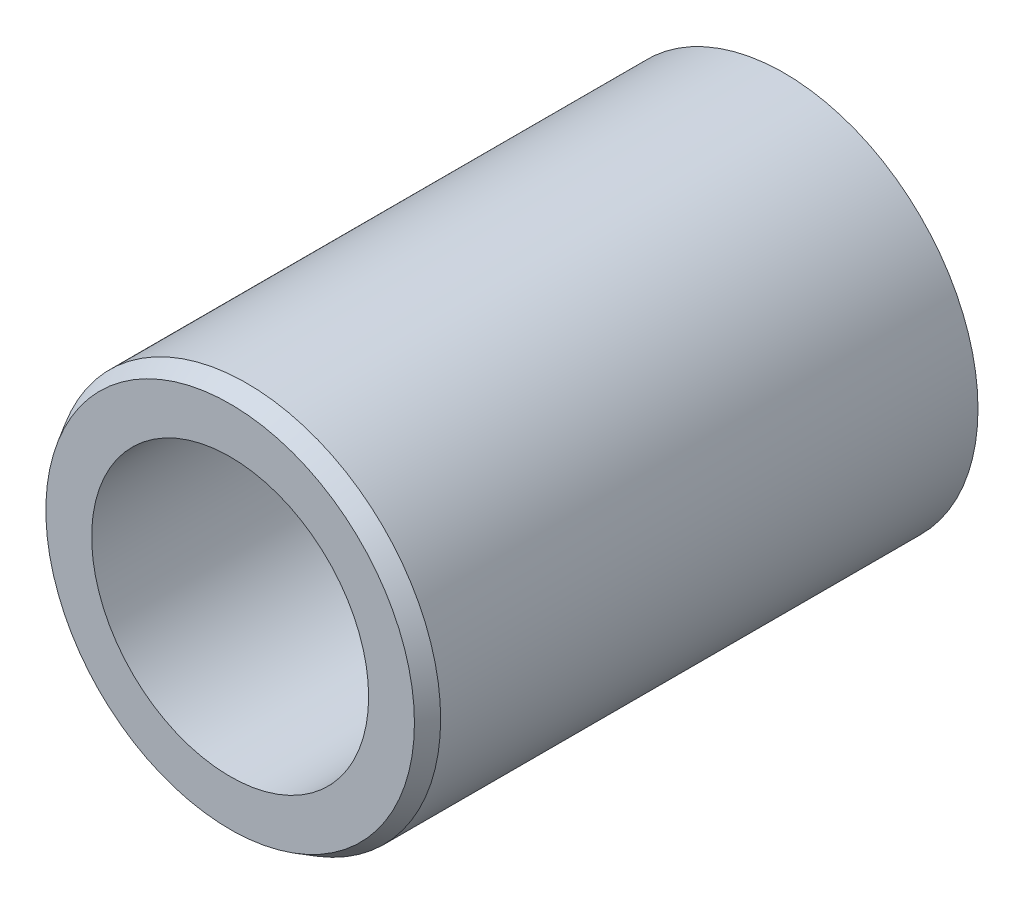
ISO-10303-21;
HEADER;
FILE_DESCRIPTION(('STEP AP214'),'2;1');
FILE_NAME('part.step','',(''),(''),'','','');
FILE_SCHEMA(('AUTOMOTIVE_DESIGN { 1 0 10303 214 1 1 1 1 }'));
ENDSEC;
DATA;
#1=APPLICATION_CONTEXT('core data for automotive mechanical design processes');
#2=APPLICATION_PROTOCOL_DEFINITION('international standard','automotive_design',2000,#1);
#3=PRODUCT_CONTEXT('',#1,'mechanical');
#4=PRODUCT('Part','Part','',(#3));
#5=PRODUCT_RELATED_PRODUCT_CATEGORY('part','',(#4));
#6=PRODUCT_DEFINITION_FORMATION('','',#4);
#7=PRODUCT_DEFINITION_CONTEXT('part definition',#1,'design');
#8=PRODUCT_DEFINITION('design','',#6,#7);
#9=PRODUCT_DEFINITION_SHAPE('','',#8);
#10=(LENGTH_UNIT() NAMED_UNIT(*) SI_UNIT(.MILLI.,.METRE.));
#11=(NAMED_UNIT(*) PLANE_ANGLE_UNIT() SI_UNIT($,.RADIAN.));
#12=(NAMED_UNIT(*) SI_UNIT($,.STERADIAN.) SOLID_ANGLE_UNIT());
#13=UNCERTAINTY_MEASURE_WITH_UNIT(LENGTH_MEASURE(1.E-05),#10,'distance_accuracy_value','');
#14=(GEOMETRIC_REPRESENTATION_CONTEXT(3) GLOBAL_UNCERTAINTY_ASSIGNED_CONTEXT((#13)) GLOBAL_UNIT_ASSIGNED_CONTEXT((#10,
#11,#12)) REPRESENTATION_CONTEXT('',''));
#15=CARTESIAN_POINT('',(0.,0.,0.));
#16=DIRECTION('',(0.,0.,1.));
#17=DIRECTION('',(1.,0.,0.));
#18=AXIS2_PLACEMENT_3D('',#15,#16,#17);
#19=CARTESIAN_POINT('',(3.49999999995587,0.,-1.25203642812936E-11));
#20=DIRECTION('',(0.,0.,-1.));
#21=DIRECTION('',(-1.,0.,0.));
#22=AXIS2_PLACEMENT_3D('',#19,#20,#21);
#23=PLANE('',#22);
#24=CARTESIAN_POINT('',(0.,0.,-1.25203207252076E-11));
#25=DIRECTION('',(0.,0.,1.));
#26=DIRECTION('',(1.,0.,0.));
#27=AXIS2_PLACEMENT_3D('',#24,#25,#26);
#28=CIRCLE('',#27,2.78867513459521);
#29=CARTESIAN_POINT('',(2.78867513459521,0.,-1.25203207252076E-11));
#30=VERTEX_POINT('',#29);
#31=EDGE_CURVE('E10',#30,#30,#28,.T.);
#32=ORIENTED_EDGE('',*,*,#31,.T.);
#33=EDGE_LOOP('',(#32));
#34=FACE_BOUND('',#33,.T.);
#35=CARTESIAN_POINT('',(0.,0.,-1.25204078373796E-11));
#36=DIRECTION('',(0.,0.,1.));
#37=DIRECTION('',(1.,0.,0.));
#38=AXIS2_PLACEMENT_3D('',#35,#36,#37);
#39=CIRCLE('',#38,3.49999999995587);
#40=CARTESIAN_POINT('',(3.49999999995587,0.,-1.25204078373796E-11));
#41=VERTEX_POINT('',#40);
#42=EDGE_CURVE('E52',#41,#41,#39,.T.);
#43=ORIENTED_EDGE('',*,*,#42,.F.);
#44=EDGE_LOOP('',(#43));
#45=FACE_BOUND('',#44,.T.);
#46=ADVANCED_FACE('F30',(#34,#45),#23,.T.);
#47=CARTESIAN_POINT('',(0.,0.,-1.25203207252076E-11));
#48=DIRECTION('',(0.,0.,-1.));
#49=DIRECTION('',(-1.,0.,0.));
#50=AXIS2_PLACEMENT_3D('',#47,#48,#49);
#51=CONICAL_SURFACE('',#50,2.78867513459521,0.523598775598299);
#52=CARTESIAN_POINT('',(0.,0.,0.499999999988177));
#53=DIRECTION('',(0.,0.,1.));
#54=DIRECTION('',(1.,0.,0.));
#55=AXIS2_PLACEMENT_3D('',#52,#53,#54);
#56=CIRCLE('',#55,2.5);
#57=CARTESIAN_POINT('',(2.5,0.,0.499999999988177));
#58=VERTEX_POINT('',#57);
#59=EDGE_CURVE('E36',#58,#58,#56,.T.);
#60=ORIENTED_EDGE('',*,*,#59,.T.);
#61=EDGE_LOOP('',(#60));
#62=FACE_BOUND('',#61,.T.);
#63=ORIENTED_EDGE('',*,*,#31,.F.);
#64=EDGE_LOOP('',(#63));
#65=FACE_BOUND('',#64,.T.);
#66=ADVANCED_FACE('F60',(#62,#65),#51,.F.);
#67=CARTESIAN_POINT('',(0.,0.,0.));
#68=DIRECTION('',(0.,0.,1.));
#69=DIRECTION('',(1.,0.,0.));
#70=AXIS2_PLACEMENT_3D('',#67,#68,#69);
#71=CYLINDRICAL_SURFACE('',#70,2.5);
#72=CARTESIAN_POINT('',(0.,0.,10.));
#73=DIRECTION('',(0.,0.,1.));
#74=DIRECTION('',(1.,0.,0.));
#75=AXIS2_PLACEMENT_3D('',#72,#73,#74);
#76=CIRCLE('',#75,2.5);
#77=CARTESIAN_POINT('',(2.5,0.,10.));
#78=VERTEX_POINT('',#77);
#79=EDGE_CURVE('E40',#78,#78,#76,.T.);
#80=ORIENTED_EDGE('',*,*,#79,.T.);
#81=EDGE_LOOP('',(#80));
#82=FACE_BOUND('',#81,.T.);
#83=ORIENTED_EDGE('',*,*,#59,.F.);
#84=EDGE_LOOP('',(#83));
#85=FACE_BOUND('',#84,.T.);
#86=ADVANCED_FACE('F64',(#82,#85),#71,.F.);
#87=CARTESIAN_POINT('',(2.5,0.,10.));
#88=DIRECTION('',(0.,0.,1.));
#89=DIRECTION('',(1.,0.,0.));
#90=AXIS2_PLACEMENT_3D('',#87,#88,#89);
#91=PLANE('',#90);
#92=CARTESIAN_POINT('',(0.,0.,10.));
#93=DIRECTION('',(0.,0.,1.));
#94=DIRECTION('',(1.,0.,0.));
#95=AXIS2_PLACEMENT_3D('',#92,#93,#94);
#96=CIRCLE('',#95,3.32679491918952);
#97=CARTESIAN_POINT('',(3.32679491918952,0.,10.));
#98=VERTEX_POINT('',#97);
#99=EDGE_CURVE('E44',#98,#98,#96,.T.);
#100=ORIENTED_EDGE('',*,*,#99,.T.);
#101=EDGE_LOOP('',(#100));
#102=FACE_BOUND('',#101,.T.);
#103=ORIENTED_EDGE('',*,*,#79,.F.);
#104=EDGE_LOOP('',(#103));
#105=FACE_BOUND('',#104,.T.);
#106=ADVANCED_FACE('F68',(#102,#105),#91,.T.);
#107=CARTESIAN_POINT('',(0.,0.,10.));
#108=DIRECTION('',(0.,0.,-1.));
#109=DIRECTION('',(-1.,0.,0.));
#110=AXIS2_PLACEMENT_3D('',#107,#108,#109);
#111=CONICAL_SURFACE('',#110,3.32679491918952,0.523598775598299);
#112=CARTESIAN_POINT('',(0.,0.,9.69999999998362));
#113=DIRECTION('',(0.,0.,1.));
#114=DIRECTION('',(1.,0.,0.));
#115=AXIS2_PLACEMENT_3D('',#112,#113,#114);
#116=CIRCLE('',#115,3.49999999995587);
#117=CARTESIAN_POINT('',(3.49999999995587,0.,9.69999999998362));
#118=VERTEX_POINT('',#117);
#119=EDGE_CURVE('E49',#118,#118,#116,.T.);
#120=ORIENTED_EDGE('',*,*,#119,.T.);
#121=EDGE_LOOP('',(#120));
#122=FACE_BOUND('',#121,.T.);
#123=ORIENTED_EDGE('',*,*,#99,.F.);
#124=EDGE_LOOP('',(#123));
#125=FACE_BOUND('',#124,.T.);
#126=ADVANCED_FACE('F75',(#122,#125),#111,.T.);
#127=CARTESIAN_POINT('',(0.,0.,0.));
#128=DIRECTION('',(0.,0.,1.));
#129=DIRECTION('',(1.,0.,0.));
#130=AXIS2_PLACEMENT_3D('',#127,#128,#129);
#131=CYLINDRICAL_SURFACE('',#130,3.49999999995587);
#132=ORIENTED_EDGE('',*,*,#42,.T.);
#133=EDGE_LOOP('',(#132));
#134=FACE_BOUND('',#133,.T.);
#135=ORIENTED_EDGE('',*,*,#119,.F.);
#136=EDGE_LOOP('',(#135));
#137=FACE_BOUND('',#136,.T.);
#138=ADVANCED_FACE('F56',(#134,#137),#131,.T.);
#139=CLOSED_SHELL('',(#46,#66,#86,#106,#126,#138));
#140=MANIFOLD_SOLID_BREP('B2',#139);
#141=ADVANCED_BREP_SHAPE_REPRESENTATION('',(#18,#140),#14);
#142=SHAPE_DEFINITION_REPRESENTATION(#9,#141);
ENDSEC;
END-ISO-10303-21;
